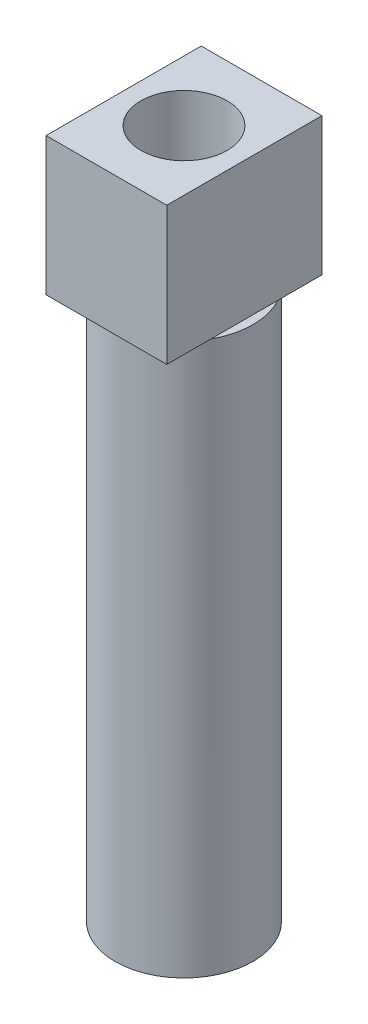
ISO-10303-21;
HEADER;
FILE_DESCRIPTION(('STEP AP214'),'2;1');
FILE_NAME('part.step','',(''),(''),'','','');
FILE_SCHEMA(('AUTOMOTIVE_DESIGN { 1 0 10303 214 1 1 1 1 }'));
ENDSEC;
DATA;
#1=APPLICATION_CONTEXT('core data for automotive mechanical design processes');
#2=APPLICATION_PROTOCOL_DEFINITION('international standard','automotive_design',2000,#1);
#3=PRODUCT_CONTEXT('',#1,'mechanical');
#4=PRODUCT('Part','Part','',(#3));
#5=PRODUCT_RELATED_PRODUCT_CATEGORY('part','',(#4));
#6=PRODUCT_DEFINITION_FORMATION('','',#4);
#7=PRODUCT_DEFINITION_CONTEXT('part definition',#1,'design');
#8=PRODUCT_DEFINITION('design','',#6,#7);
#9=PRODUCT_DEFINITION_SHAPE('','',#8);
#10=(LENGTH_UNIT() NAMED_UNIT(*) SI_UNIT(.MILLI.,.METRE.));
#11=(NAMED_UNIT(*) PLANE_ANGLE_UNIT() SI_UNIT($,.RADIAN.));
#12=(NAMED_UNIT(*) SI_UNIT($,.STERADIAN.) SOLID_ANGLE_UNIT());
#13=UNCERTAINTY_MEASURE_WITH_UNIT(LENGTH_MEASURE(1.E-05),#10,'distance_accuracy_value','');
#14=(GEOMETRIC_REPRESENTATION_CONTEXT(3) GLOBAL_UNCERTAINTY_ASSIGNED_CONTEXT((#13)) GLOBAL_UNIT_ASSIGNED_CONTEXT((#10,
#11,#12)) REPRESENTATION_CONTEXT('',''));
#15=CARTESIAN_POINT('',(0.,0.,0.));
#16=DIRECTION('',(0.,0.,1.));
#17=DIRECTION('',(1.,0.,0.));
#18=AXIS2_PLACEMENT_3D('',#15,#16,#17);
#19=CARTESIAN_POINT('',(0.,0.,0.));
#20=DIRECTION('',(0.,1.,0.));
#21=DIRECTION('',(0.,0.,1.));
#22=AXIS2_PLACEMENT_3D('',#19,#20,#21);
#23=PLANE('',#22);
#24=CARTESIAN_POINT('',(0.,0.,0.));
#25=DIRECTION('',(0.,1.,0.));
#26=DIRECTION('',(0.,0.,1.));
#27=AXIS2_PLACEMENT_3D('',#24,#25,#26);
#28=CIRCLE('',#27,12.5);
#29=CARTESIAN_POINT('',(0.,0.,12.5));
#30=VERTEX_POINT('',#29);
#31=EDGE_CURVE('E173',#30,#30,#28,.T.);
#32=ORIENTED_EDGE('',*,*,#31,.T.);
#33=EDGE_LOOP('',(#32));
#34=FACE_BOUND('',#33,.T.);
#35=CARTESIAN_POINT('',(0.,0.,0.));
#36=DIRECTION('',(0.,1.,0.));
#37=DIRECTION('',(0.,0.,1.));
#38=AXIS2_PLACEMENT_3D('',#35,#36,#37);
#39=CIRCLE('',#38,13.5);
#40=CARTESIAN_POINT('',(0.,0.,13.5));
#41=VERTEX_POINT('',#40);
#42=EDGE_CURVE('E182',#41,#41,#39,.T.);
#43=ORIENTED_EDGE('',*,*,#42,.F.);
#44=EDGE_LOOP('',(#43));
#45=FACE_BOUND('',#44,.T.);
#46=ADVANCED_FACE('F35',(#34,#45),#23,.F.);
#47=CARTESIAN_POINT('',(0.,160.,0.));
#48=DIRECTION('',(0.,1.,0.));
#49=DIRECTION('',(0.,0.,1.));
#50=AXIS2_PLACEMENT_3D('',#47,#48,#49);
#51=PLANE('',#50);
#52=DIRECTION('',(0.,0.,-1.));
#53=VECTOR('',#52,1.);
#54=CARTESIAN_POINT('',(17.5,160.,-22.5));
#55=LINE('',#54,#53);
#56=CARTESIAN_POINT('',(17.5,160.,9.68245836551855));
#57=VERTEX_POINT('',#56);
#58=CARTESIAN_POINT('',(17.5,160.,-9.68245836551856));
#59=VERTEX_POINT('',#58);
#60=EDGE_CURVE('E11',#57,#59,#55,.T.);
#61=ORIENTED_EDGE('',*,*,#60,.F.);
#62=CARTESIAN_POINT('',(0.,160.,0.));
#63=DIRECTION('',(0.,1.,0.));
#64=DIRECTION('',(0.,0.,1.));
#65=AXIS2_PLACEMENT_3D('',#62,#63,#64);
#66=CIRCLE('',#65,20.);
#67=EDGE_CURVE('E218',#57,#59,#66,.T.);
#68=ORIENTED_EDGE('',*,*,#67,.T.);
#69=EDGE_LOOP('',(#61,#68));
#70=FACE_BOUND('',#69,.T.);
#71=ADVANCED_FACE('F245',(#70),#51,.T.);
#72=CARTESIAN_POINT('',(0.,160.,0.));
#73=DIRECTION('',(0.,-1.,0.));
#74=DIRECTION('',(0.,0.,-1.));
#75=AXIS2_PLACEMENT_3D('',#72,#73,#74);
#76=CYLINDRICAL_SURFACE('',#75,20.);
#77=ORIENTED_EDGE('',*,*,#67,.F.);
#78=CARTESIAN_POINT('',(-17.5,160.,9.68245836551854));
#79=VERTEX_POINT('',#78);
#80=EDGE_CURVE('E219',#79,#57,#66,.T.);
#81=ORIENTED_EDGE('',*,*,#80,.F.);
#82=CARTESIAN_POINT('',(-17.5,160.,-9.68245836551855));
#83=VERTEX_POINT('',#82);
#84=EDGE_CURVE('E222',#83,#79,#66,.T.);
#85=ORIENTED_EDGE('',*,*,#84,.F.);
#86=EDGE_CURVE('E59',#59,#83,#66,.T.);
#87=ORIENTED_EDGE('',*,*,#86,.F.);
#88=EDGE_LOOP('',(#77,#81,#85,#87));
#89=FACE_BOUND('',#88,.T.);
#90=CARTESIAN_POINT('',(0.,0.,0.));
#91=DIRECTION('',(0.,1.,0.));
#92=DIRECTION('',(0.,0.,1.));
#93=AXIS2_PLACEMENT_3D('',#90,#91,#92);
#94=CIRCLE('',#93,20.);
#95=CARTESIAN_POINT('',(0.,0.,20.));
#96=VERTEX_POINT('',#95);
#97=EDGE_CURVE('E39',#96,#96,#94,.T.);
#98=ORIENTED_EDGE('',*,*,#97,.T.);
#99=EDGE_LOOP('',(#98));
#100=FACE_BOUND('',#99,.T.);
#101=ADVANCED_FACE('F37',(#89,#100),#76,.T.);
#102=DIRECTION('',(0.,0.,1.));
#103=VECTOR('',#102,1.);
#104=CARTESIAN_POINT('',(-17.5,160.,-22.5));
#105=LINE('',#104,#103);
#106=EDGE_CURVE('E44',#83,#79,#105,.T.);
#107=ORIENTED_EDGE('',*,*,#106,.F.);
#108=ORIENTED_EDGE('',*,*,#84,.T.);
#109=EDGE_LOOP('',(#107,#108));
#110=FACE_BOUND('',#109,.T.);
#111=ADVANCED_FACE('F235',(#110),#51,.T.);
#112=CARTESIAN_POINT('',(0.,0.,0.));
#113=DIRECTION('',(0.,1.,0.));
#114=DIRECTION('',(0.,0.,1.));
#115=AXIS2_PLACEMENT_3D('',#112,#113,#114);
#116=CIRCLE('',#115,19.);
#117=CARTESIAN_POINT('',(0.,0.,19.));
#118=VERTEX_POINT('',#117);
#119=EDGE_CURVE('E150',#118,#118,#116,.T.);
#120=ORIENTED_EDGE('',*,*,#119,.T.);
#121=EDGE_LOOP('',(#120));
#122=FACE_BOUND('',#121,.T.);
#123=ORIENTED_EDGE('',*,*,#97,.F.);
#124=EDGE_LOOP('',(#123));
#125=FACE_BOUND('',#124,.T.);
#126=ADVANCED_FACE('F232',(#122,#125),#23,.F.);
#127=CARTESIAN_POINT('',(0.,160.,0.));
#128=DIRECTION('',(0.,1.,0.));
#129=DIRECTION('',(0.,0.,1.));
#130=AXIS2_PLACEMENT_3D('',#127,#128,#129);
#131=PLANE('',#130);
#132=CARTESIAN_POINT('',(17.5,160.,-22.5));
#133=VERTEX_POINT('',#132);
#134=EDGE_CURVE('E47',#59,#133,#55,.T.);
#135=ORIENTED_EDGE('',*,*,#134,.F.);
#136=ORIENTED_EDGE('',*,*,#86,.T.);
#137=CARTESIAN_POINT('',(-17.5,160.,-22.5));
#138=VERTEX_POINT('',#137);
#139=EDGE_CURVE('E204',#138,#83,#105,.T.);
#140=ORIENTED_EDGE('',*,*,#139,.F.);
#141=DIRECTION('',(-1.,0.,0.));
#142=VECTOR('',#141,1.);
#143=CARTESIAN_POINT('',(-17.5,160.,-22.5));
#144=LINE('',#143,#142);
#145=EDGE_CURVE('E201',#133,#138,#144,.T.);
#146=ORIENTED_EDGE('',*,*,#145,.F.);
#147=EDGE_LOOP('',(#135,#136,#140,#146));
#148=FACE_BOUND('',#147,.T.);
#149=ADVANCED_FACE('F234',(#148),#131,.F.);
#150=CARTESIAN_POINT('',(-17.5,160.,22.5));
#151=VERTEX_POINT('',#150);
#152=EDGE_CURVE('E203',#79,#151,#105,.T.);
#153=ORIENTED_EDGE('',*,*,#152,.F.);
#154=ORIENTED_EDGE('',*,*,#80,.T.);
#155=CARTESIAN_POINT('',(17.5,160.,22.5));
#156=VERTEX_POINT('',#155);
#157=EDGE_CURVE('E46',#156,#57,#55,.T.);
#158=ORIENTED_EDGE('',*,*,#157,.F.);
#159=DIRECTION('',(1.,0.,0.));
#160=VECTOR('',#159,1.);
#161=CARTESIAN_POINT('',(-17.5,160.,22.5));
#162=LINE('',#161,#160);
#163=EDGE_CURVE('E193',#151,#156,#162,.T.);
#164=ORIENTED_EDGE('',*,*,#163,.F.);
#165=EDGE_LOOP('',(#153,#154,#158,#164));
#166=FACE_BOUND('',#165,.T.);
#167=ADVANCED_FACE('F241',(#166),#131,.F.);
#168=CARTESIAN_POINT('',(17.5,200.,-22.5));
#169=DIRECTION('',(-1.,0.,0.));
#170=DIRECTION('',(0.,0.,1.));
#171=AXIS2_PLACEMENT_3D('',#168,#169,#170);
#172=PLANE('',#171);
#173=ORIENTED_EDGE('',*,*,#157,.T.);
#174=ORIENTED_EDGE('',*,*,#60,.T.);
#175=ORIENTED_EDGE('',*,*,#134,.T.);
#176=DIRECTION('',(0.,-1.,0.));
#177=VECTOR('',#176,1.);
#178=CARTESIAN_POINT('',(17.5,200.,-22.5));
#179=LINE('',#178,#177);
#180=CARTESIAN_POINT('',(17.5,200.,-22.5));
#181=VERTEX_POINT('',#180);
#182=EDGE_CURVE('E216',#181,#133,#179,.T.);
#183=ORIENTED_EDGE('',*,*,#182,.F.);
#184=DIRECTION('',(0.,0.,-1.));
#185=VECTOR('',#184,1.);
#186=CARTESIAN_POINT('',(17.5,200.,-22.5));
#187=LINE('',#186,#185);
#188=CARTESIAN_POINT('',(17.5,200.,22.5));
#189=VERTEX_POINT('',#188);
#190=EDGE_CURVE('E189',#189,#181,#187,.T.);
#191=ORIENTED_EDGE('',*,*,#190,.F.);
#192=DIRECTION('',(0.,-1.,0.));
#193=VECTOR('',#192,1.);
#194=CARTESIAN_POINT('',(17.5,200.,22.5));
#195=LINE('',#194,#193);
#196=EDGE_CURVE('E198',#189,#156,#195,.T.);
#197=ORIENTED_EDGE('',*,*,#196,.T.);
#198=EDGE_LOOP('',(#173,#174,#175,#183,#191,#197));
#199=FACE_BOUND('',#198,.T.);
#200=ADVANCED_FACE('F370',(#199),#172,.F.);
#201=CARTESIAN_POINT('',(-17.5,200.,-22.5));
#202=DIRECTION('',(0.,0.,1.));
#203=DIRECTION('',(1.,0.,0.));
#204=AXIS2_PLACEMENT_3D('',#201,#202,#203);
#205=PLANE('',#204);
#206=ORIENTED_EDGE('',*,*,#145,.T.);
#207=DIRECTION('',(0.,-1.,0.));
#208=VECTOR('',#207,1.);
#209=CARTESIAN_POINT('',(-17.5,200.,-22.5));
#210=LINE('',#209,#208);
#211=CARTESIAN_POINT('',(-17.5,200.,-22.5));
#212=VERTEX_POINT('',#211);
#213=EDGE_CURVE('E213',#212,#138,#210,.T.);
#214=ORIENTED_EDGE('',*,*,#213,.F.);
#215=DIRECTION('',(-1.,0.,0.));
#216=VECTOR('',#215,1.);
#217=CARTESIAN_POINT('',(-17.5,200.,-22.5));
#218=LINE('',#217,#216);
#219=EDGE_CURVE('E192',#181,#212,#218,.T.);
#220=ORIENTED_EDGE('',*,*,#219,.F.);
#221=ORIENTED_EDGE('',*,*,#182,.T.);
#222=EDGE_LOOP('',(#206,#214,#220,#221));
#223=FACE_BOUND('',#222,.T.);
#224=ADVANCED_FACE('F366',(#223),#205,.F.);
#225=CARTESIAN_POINT('',(-17.5,200.,-22.5));
#226=DIRECTION('',(1.,0.,0.));
#227=DIRECTION('',(0.,0.,-1.));
#228=AXIS2_PLACEMENT_3D('',#225,#226,#227);
#229=PLANE('',#228);
#230=ORIENTED_EDGE('',*,*,#139,.T.);
#231=ORIENTED_EDGE('',*,*,#106,.T.);
#232=ORIENTED_EDGE('',*,*,#152,.T.);
#233=DIRECTION('',(0.,-1.,0.));
#234=VECTOR('',#233,1.);
#235=CARTESIAN_POINT('',(-17.5,200.,22.5));
#236=LINE('',#235,#234);
#237=CARTESIAN_POINT('',(-17.5,200.,22.5));
#238=VERTEX_POINT('',#237);
#239=EDGE_CURVE('E210',#238,#151,#236,.T.);
#240=ORIENTED_EDGE('',*,*,#239,.F.);
#241=DIRECTION('',(0.,0.,1.));
#242=VECTOR('',#241,1.);
#243=CARTESIAN_POINT('',(-17.5,200.,-22.5));
#244=LINE('',#243,#242);
#245=EDGE_CURVE('E195',#212,#238,#244,.T.);
#246=ORIENTED_EDGE('',*,*,#245,.F.);
#247=ORIENTED_EDGE('',*,*,#213,.T.);
#248=EDGE_LOOP('',(#230,#231,#232,#240,#246,#247));
#249=FACE_BOUND('',#248,.T.);
#250=ADVANCED_FACE('F362',(#249),#229,.F.);
#251=CARTESIAN_POINT('',(-17.5,200.,22.5));
#252=DIRECTION('',(0.,0.,-1.));
#253=DIRECTION('',(-1.,0.,0.));
#254=AXIS2_PLACEMENT_3D('',#251,#252,#253);
#255=PLANE('',#254);
#256=ORIENTED_EDGE('',*,*,#163,.T.);
#257=ORIENTED_EDGE('',*,*,#196,.F.);
#258=DIRECTION('',(1.,0.,0.));
#259=VECTOR('',#258,1.);
#260=CARTESIAN_POINT('',(-17.5,200.,22.5));
#261=LINE('',#260,#259);
#262=EDGE_CURVE('E197',#238,#189,#261,.T.);
#263=ORIENTED_EDGE('',*,*,#262,.F.);
#264=ORIENTED_EDGE('',*,*,#239,.T.);
#265=EDGE_LOOP('',(#256,#257,#263,#264));
#266=FACE_BOUND('',#265,.T.);
#267=ADVANCED_FACE('F357',(#266),#255,.F.);
#268=CARTESIAN_POINT('',(0.,200.,0.));
#269=DIRECTION('',(0.,1.,0.));
#270=DIRECTION('',(0.,0.,1.));
#271=AXIS2_PLACEMENT_3D('',#268,#269,#270);
#272=PLANE('',#271);
#273=CARTESIAN_POINT('',(0.,200.,0.));
#274=DIRECTION('',(0.,1.,0.));
#275=DIRECTION('',(0.,0.,1.));
#276=AXIS2_PLACEMENT_3D('',#273,#274,#275);
#277=CIRCLE('',#276,12.5);
#278=CARTESIAN_POINT('',(0.,200.,12.5));
#279=VERTEX_POINT('',#278);
#280=EDGE_CURVE('E169',#279,#279,#277,.T.);
#281=ORIENTED_EDGE('',*,*,#280,.F.);
#282=EDGE_LOOP('',(#281));
#283=FACE_BOUND('',#282,.T.);
#284=ORIENTED_EDGE('',*,*,#190,.T.);
#285=ORIENTED_EDGE('',*,*,#219,.T.);
#286=ORIENTED_EDGE('',*,*,#245,.T.);
#287=ORIENTED_EDGE('',*,*,#262,.T.);
#288=EDGE_LOOP('',(#284,#285,#286,#287));
#289=FACE_BOUND('',#288,.T.);
#290=ADVANCED_FACE('F332',(#283,#289),#272,.T.);
#291=CARTESIAN_POINT('',(0.,0.,0.));
#292=DIRECTION('',(0.,1.,0.));
#293=DIRECTION('',(0.,0.,1.));
#294=AXIS2_PLACEMENT_3D('',#291,#292,#293);
#295=CYLINDRICAL_SURFACE('',#294,12.5);
#296=ORIENTED_EDGE('',*,*,#31,.F.);
#297=EDGE_LOOP('',(#296));
#298=FACE_BOUND('',#297,.T.);
#299=ORIENTED_EDGE('',*,*,#280,.T.);
#300=EDGE_LOOP('',(#299));
#301=FACE_BOUND('',#300,.T.);
#302=ADVANCED_FACE('F324',(#298,#301),#295,.F.);
#303=CARTESIAN_POINT('',(0.,159.,0.));
#304=DIRECTION('',(0.,1.,0.));
#305=DIRECTION('',(0.,0.,1.));
#306=AXIS2_PLACEMENT_3D('',#303,#304,#305);
#307=PLANE('',#306);
#308=DIRECTION('',(0.,0.,-1.));
#309=VECTOR('',#308,1.);
#310=CARTESIAN_POINT('',(16.5,159.,-22.5));
#311=LINE('',#310,#309);
#312=CARTESIAN_POINT('',(16.5,159.,9.42072184070839));
#313=VERTEX_POINT('',#312);
#314=CARTESIAN_POINT('',(16.5,159.,-9.42072184070839));
#315=VERTEX_POINT('',#314);
#316=EDGE_CURVE('E274',#313,#315,#311,.T.);
#317=ORIENTED_EDGE('',*,*,#316,.T.);
#318=CARTESIAN_POINT('',(0.,159.,0.));
#319=DIRECTION('',(0.,1.,0.));
#320=DIRECTION('',(0.,0.,1.));
#321=AXIS2_PLACEMENT_3D('',#318,#319,#320);
#322=CIRCLE('',#321,19.);
#323=EDGE_CURVE('E282',#313,#315,#322,.T.);
#324=ORIENTED_EDGE('',*,*,#323,.F.);
#325=EDGE_LOOP('',(#317,#324));
#326=FACE_BOUND('',#325,.T.);
#327=ADVANCED_FACE('F321',(#326),#307,.F.);
#328=CARTESIAN_POINT('',(0.,160.,0.));
#329=DIRECTION('',(0.,-1.,0.));
#330=DIRECTION('',(0.,0.,-1.));
#331=AXIS2_PLACEMENT_3D('',#328,#329,#330);
#332=CYLINDRICAL_SURFACE('',#331,19.);
#333=ORIENTED_EDGE('',*,*,#323,.T.);
#334=DIRECTION('',(0.,-1.,0.));
#335=VECTOR('',#334,1.);
#336=CARTESIAN_POINT('',(16.5,159.,-9.42072184070839));
#337=LINE('',#336,#335);
#338=CARTESIAN_POINT('',(16.5,161.,-9.42072184070839));
#339=VERTEX_POINT('',#338);
#340=EDGE_CURVE('E272',#315,#339,#337,.F.);
#341=ORIENTED_EDGE('',*,*,#340,.T.);
#342=CARTESIAN_POINT('',(0.,161.,0.));
#343=DIRECTION('',(0.,1.,0.));
#344=DIRECTION('',(0.,0.,1.));
#345=AXIS2_PLACEMENT_3D('',#342,#343,#344);
#346=CIRCLE('',#345,19.);
#347=CARTESIAN_POINT('',(-16.5,161.,-9.42072184070839));
#348=VERTEX_POINT('',#347);
#349=EDGE_CURVE('E279',#339,#348,#346,.T.);
#350=ORIENTED_EDGE('',*,*,#349,.T.);
#351=DIRECTION('',(0.,-1.,0.));
#352=VECTOR('',#351,1.);
#353=CARTESIAN_POINT('',(-16.5,159.,-9.42072184070839));
#354=LINE('',#353,#352);
#355=CARTESIAN_POINT('',(-16.5,159.,-9.42072184070839));
#356=VERTEX_POINT('',#355);
#357=EDGE_CURVE('E175',#356,#348,#354,.F.);
#358=ORIENTED_EDGE('',*,*,#357,.F.);
#359=CARTESIAN_POINT('',(0.,159.,0.));
#360=DIRECTION('',(0.,1.,0.));
#361=DIRECTION('',(0.,0.,1.));
#362=AXIS2_PLACEMENT_3D('',#359,#360,#361);
#363=CIRCLE('',#362,19.);
#364=CARTESIAN_POINT('',(-16.5,159.,9.42072184070839));
#365=VERTEX_POINT('',#364);
#366=EDGE_CURVE('E149',#356,#365,#363,.T.);
#367=ORIENTED_EDGE('',*,*,#366,.T.);
#368=DIRECTION('',(0.,-1.,0.));
#369=VECTOR('',#368,1.);
#370=CARTESIAN_POINT('',(-16.5,159.,9.42072184070839));
#371=LINE('',#370,#369);
#372=CARTESIAN_POINT('',(-16.5,161.,9.42072184070839));
#373=VERTEX_POINT('',#372);
#374=EDGE_CURVE('E156',#365,#373,#371,.F.);
#375=ORIENTED_EDGE('',*,*,#374,.T.);
#376=CARTESIAN_POINT('',(0.,161.,0.));
#377=DIRECTION('',(0.,1.,0.));
#378=DIRECTION('',(0.,0.,1.));
#379=AXIS2_PLACEMENT_3D('',#376,#377,#378);
#380=CIRCLE('',#379,19.);
#381=CARTESIAN_POINT('',(16.5,161.,9.42072184070839));
#382=VERTEX_POINT('',#381);
#383=EDGE_CURVE('E139',#373,#382,#380,.T.);
#384=ORIENTED_EDGE('',*,*,#383,.T.);
#385=DIRECTION('',(0.,-1.,0.));
#386=VECTOR('',#385,1.);
#387=CARTESIAN_POINT('',(16.5,159.,9.42072184070839));
#388=LINE('',#387,#386);
#389=EDGE_CURVE('E170',#313,#382,#388,.F.);
#390=ORIENTED_EDGE('',*,*,#389,.F.);
#391=EDGE_LOOP('',(#333,#341,#350,#358,#367,#375,#384,#390));
#392=FACE_BOUND('',#391,.T.);
#393=ORIENTED_EDGE('',*,*,#119,.F.);
#394=EDGE_LOOP('',(#393));
#395=FACE_BOUND('',#394,.T.);
#396=ADVANCED_FACE('F165',(#392,#395),#332,.F.);
#397=DIRECTION('',(0.,0.,1.));
#398=VECTOR('',#397,1.);
#399=CARTESIAN_POINT('',(-16.5,159.,-22.5));
#400=LINE('',#399,#398);
#401=EDGE_CURVE('E277',#356,#365,#400,.T.);
#402=ORIENTED_EDGE('',*,*,#401,.T.);
#403=ORIENTED_EDGE('',*,*,#366,.F.);
#404=EDGE_LOOP('',(#402,#403));
#405=FACE_BOUND('',#404,.T.);
#406=ADVANCED_FACE('F326',(#405),#307,.F.);
#407=CARTESIAN_POINT('',(0.,161.,0.));
#408=DIRECTION('',(0.,1.,0.));
#409=DIRECTION('',(0.,0.,1.));
#410=AXIS2_PLACEMENT_3D('',#407,#408,#409);
#411=PLANE('',#410);
#412=DIRECTION('',(0.,0.,-1.));
#413=VECTOR('',#412,1.);
#414=CARTESIAN_POINT('',(16.5,161.,-22.5));
#415=LINE('',#414,#413);
#416=CARTESIAN_POINT('',(16.5,161.,-21.5));
#417=VERTEX_POINT('',#416);
#418=EDGE_CURVE('E185',#339,#417,#415,.T.);
#419=ORIENTED_EDGE('',*,*,#418,.T.);
#420=DIRECTION('',(-1.,0.,0.));
#421=VECTOR('',#420,1.);
#422=CARTESIAN_POINT('',(-17.5,161.,-21.5));
#423=LINE('',#422,#421);
#424=CARTESIAN_POINT('',(-16.5,161.,-21.5));
#425=VERTEX_POINT('',#424);
#426=EDGE_CURVE('E162',#417,#425,#423,.T.);
#427=ORIENTED_EDGE('',*,*,#426,.T.);
#428=DIRECTION('',(0.,0.,1.));
#429=VECTOR('',#428,1.);
#430=CARTESIAN_POINT('',(-16.5,161.,-22.5));
#431=LINE('',#430,#429);
#432=EDGE_CURVE('E161',#425,#348,#431,.T.);
#433=ORIENTED_EDGE('',*,*,#432,.T.);
#434=ORIENTED_EDGE('',*,*,#349,.F.);
#435=EDGE_LOOP('',(#419,#427,#433,#434));
#436=FACE_BOUND('',#435,.T.);
#437=ADVANCED_FACE('F336',(#436),#411,.T.);
#438=DIRECTION('',(0.,0.,1.));
#439=VECTOR('',#438,1.);
#440=CARTESIAN_POINT('',(-16.5,161.,-22.5));
#441=LINE('',#440,#439);
#442=CARTESIAN_POINT('',(-16.5,161.,21.5));
#443=VERTEX_POINT('',#442);
#444=EDGE_CURVE('E142',#373,#443,#441,.T.);
#445=ORIENTED_EDGE('',*,*,#444,.T.);
#446=DIRECTION('',(1.,0.,0.));
#447=VECTOR('',#446,1.);
#448=CARTESIAN_POINT('',(-17.5,161.,21.5));
#449=LINE('',#448,#447);
#450=CARTESIAN_POINT('',(16.5,161.,21.5));
#451=VERTEX_POINT('',#450);
#452=EDGE_CURVE('E290',#443,#451,#449,.T.);
#453=ORIENTED_EDGE('',*,*,#452,.T.);
#454=DIRECTION('',(0.,0.,-1.));
#455=VECTOR('',#454,1.);
#456=CARTESIAN_POINT('',(16.5,161.,-22.5));
#457=LINE('',#456,#455);
#458=EDGE_CURVE('E145',#451,#382,#457,.T.);
#459=ORIENTED_EDGE('',*,*,#458,.T.);
#460=ORIENTED_EDGE('',*,*,#383,.F.);
#461=EDGE_LOOP('',(#445,#453,#459,#460));
#462=FACE_BOUND('',#461,.T.);
#463=ADVANCED_FACE('F141',(#462),#411,.T.);
#464=CARTESIAN_POINT('',(16.5,200.,-22.5));
#465=DIRECTION('',(-1.,0.,0.));
#466=DIRECTION('',(0.,0.,1.));
#467=AXIS2_PLACEMENT_3D('',#464,#465,#466);
#468=PLANE('',#467);
#469=ORIENTED_EDGE('',*,*,#458,.F.);
#470=DIRECTION('',(0.,-1.,0.));
#471=VECTOR('',#470,1.);
#472=CARTESIAN_POINT('',(16.5,200.,21.5));
#473=LINE('',#472,#471);
#474=CARTESIAN_POINT('',(16.5,199.,21.5));
#475=VERTEX_POINT('',#474);
#476=EDGE_CURVE('E270',#475,#451,#473,.T.);
#477=ORIENTED_EDGE('',*,*,#476,.F.);
#478=DIRECTION('',(0.,0.,-1.));
#479=VECTOR('',#478,1.);
#480=CARTESIAN_POINT('',(16.5,199.,-22.5));
#481=LINE('',#480,#479);
#482=CARTESIAN_POINT('',(16.5,199.,-21.5));
#483=VERTEX_POINT('',#482);
#484=EDGE_CURVE('E296',#475,#483,#481,.T.);
#485=ORIENTED_EDGE('',*,*,#484,.T.);
#486=DIRECTION('',(0.,-1.,0.));
#487=VECTOR('',#486,1.);
#488=CARTESIAN_POINT('',(16.5,200.,-21.5));
#489=LINE('',#488,#487);
#490=EDGE_CURVE('E181',#483,#417,#489,.T.);
#491=ORIENTED_EDGE('',*,*,#490,.T.);
#492=ORIENTED_EDGE('',*,*,#418,.F.);
#493=ORIENTED_EDGE('',*,*,#340,.F.);
#494=ORIENTED_EDGE('',*,*,#316,.F.);
#495=ORIENTED_EDGE('',*,*,#389,.T.);
#496=EDGE_LOOP('',(#469,#477,#485,#491,#492,#493,#494,#495));
#497=FACE_BOUND('',#496,.T.);
#498=ADVANCED_FACE('F316',(#497),#468,.T.);
#499=CARTESIAN_POINT('',(-17.5,200.,-21.5));
#500=DIRECTION('',(0.,0.,1.));
#501=DIRECTION('',(1.,0.,0.));
#502=AXIS2_PLACEMENT_3D('',#499,#500,#501);
#503=PLANE('',#502);
#504=ORIENTED_EDGE('',*,*,#426,.F.);
#505=ORIENTED_EDGE('',*,*,#490,.F.);
#506=DIRECTION('',(-1.,0.,0.));
#507=VECTOR('',#506,1.);
#508=CARTESIAN_POINT('',(-17.5,199.,-21.5));
#509=LINE('',#508,#507);
#510=CARTESIAN_POINT('',(-16.5,199.,-21.5));
#511=VERTEX_POINT('',#510);
#512=EDGE_CURVE('E266',#483,#511,#509,.T.);
#513=ORIENTED_EDGE('',*,*,#512,.T.);
#514=DIRECTION('',(0.,-1.,0.));
#515=VECTOR('',#514,1.);
#516=CARTESIAN_POINT('',(-16.5,200.,-21.5));
#517=LINE('',#516,#515);
#518=EDGE_CURVE('E295',#511,#425,#517,.T.);
#519=ORIENTED_EDGE('',*,*,#518,.T.);
#520=EDGE_LOOP('',(#504,#505,#513,#519));
#521=FACE_BOUND('',#520,.T.);
#522=ADVANCED_FACE('F306',(#521),#503,.T.);
#523=CARTESIAN_POINT('',(-16.5,200.,-22.5));
#524=DIRECTION('',(1.,0.,0.));
#525=DIRECTION('',(0.,0.,-1.));
#526=AXIS2_PLACEMENT_3D('',#523,#524,#525);
#527=PLANE('',#526);
#528=ORIENTED_EDGE('',*,*,#432,.F.);
#529=ORIENTED_EDGE('',*,*,#518,.F.);
#530=DIRECTION('',(0.,0.,1.));
#531=VECTOR('',#530,1.);
#532=CARTESIAN_POINT('',(-16.5,199.,-22.5));
#533=LINE('',#532,#531);
#534=CARTESIAN_POINT('',(-16.5,199.,21.5));
#535=VERTEX_POINT('',#534);
#536=EDGE_CURVE('E271',#511,#535,#533,.T.);
#537=ORIENTED_EDGE('',*,*,#536,.T.);
#538=DIRECTION('',(0.,-1.,0.));
#539=VECTOR('',#538,1.);
#540=CARTESIAN_POINT('',(-16.5,200.,21.5));
#541=LINE('',#540,#539);
#542=EDGE_CURVE('E159',#535,#443,#541,.T.);
#543=ORIENTED_EDGE('',*,*,#542,.T.);
#544=ORIENTED_EDGE('',*,*,#444,.F.);
#545=ORIENTED_EDGE('',*,*,#374,.F.);
#546=ORIENTED_EDGE('',*,*,#401,.F.);
#547=ORIENTED_EDGE('',*,*,#357,.T.);
#548=EDGE_LOOP('',(#528,#529,#537,#543,#544,#545,#546,#547));
#549=FACE_BOUND('',#548,.T.);
#550=ADVANCED_FACE('F154',(#549),#527,.T.);
#551=CARTESIAN_POINT('',(-17.5,200.,21.5));
#552=DIRECTION('',(0.,0.,-1.));
#553=DIRECTION('',(-1.,0.,0.));
#554=AXIS2_PLACEMENT_3D('',#551,#552,#553);
#555=PLANE('',#554);
#556=ORIENTED_EDGE('',*,*,#452,.F.);
#557=ORIENTED_EDGE('',*,*,#542,.F.);
#558=DIRECTION('',(1.,0.,0.));
#559=VECTOR('',#558,1.);
#560=CARTESIAN_POINT('',(-17.5,199.,21.5));
#561=LINE('',#560,#559);
#562=EDGE_CURVE('E268',#535,#475,#561,.T.);
#563=ORIENTED_EDGE('',*,*,#562,.T.);
#564=ORIENTED_EDGE('',*,*,#476,.T.);
#565=EDGE_LOOP('',(#556,#557,#563,#564));
#566=FACE_BOUND('',#565,.T.);
#567=ADVANCED_FACE('F314',(#566),#555,.T.);
#568=CARTESIAN_POINT('',(0.,199.,0.));
#569=DIRECTION('',(0.,1.,0.));
#570=DIRECTION('',(0.,0.,1.));
#571=AXIS2_PLACEMENT_3D('',#568,#569,#570);
#572=PLANE('',#571);
#573=CARTESIAN_POINT('',(0.,199.,0.));
#574=DIRECTION('',(0.,1.,0.));
#575=DIRECTION('',(0.,0.,1.));
#576=AXIS2_PLACEMENT_3D('',#573,#574,#575);
#577=CIRCLE('',#576,13.5);
#578=CARTESIAN_POINT('',(0.,199.,13.5));
#579=VERTEX_POINT('',#578);
#580=EDGE_CURVE('E186',#579,#579,#577,.T.);
#581=ORIENTED_EDGE('',*,*,#580,.T.);
#582=EDGE_LOOP('',(#581));
#583=FACE_BOUND('',#582,.T.);
#584=ORIENTED_EDGE('',*,*,#484,.F.);
#585=ORIENTED_EDGE('',*,*,#562,.F.);
#586=ORIENTED_EDGE('',*,*,#536,.F.);
#587=ORIENTED_EDGE('',*,*,#512,.F.);
#588=EDGE_LOOP('',(#584,#585,#586,#587));
#589=FACE_BOUND('',#588,.T.);
#590=ADVANCED_FACE('F258',(#583,#589),#572,.F.);
#591=CARTESIAN_POINT('',(0.,0.,0.));
#592=DIRECTION('',(0.,1.,0.));
#593=DIRECTION('',(0.,0.,1.));
#594=AXIS2_PLACEMENT_3D('',#591,#592,#593);
#595=CYLINDRICAL_SURFACE('',#594,13.5);
#596=ORIENTED_EDGE('',*,*,#42,.T.);
#597=EDGE_LOOP('',(#596));
#598=FACE_BOUND('',#597,.T.);
#599=ORIENTED_EDGE('',*,*,#580,.F.);
#600=EDGE_LOOP('',(#599));
#601=FACE_BOUND('',#600,.T.);
#602=ADVANCED_FACE('F255',(#598,#601),#595,.T.);
#603=CLOSED_SHELL('',(#46,#71,#101,#111,#126,#149,#167,#200,#224,#250,#267,#290,#302,#327,#396,
#406,#437,#463,#498,#522,#550,#567,#590,#602));
#604=MANIFOLD_SOLID_BREP('B2',#603);
#605=ADVANCED_BREP_SHAPE_REPRESENTATION('',(#18,#604),#14);
#606=SHAPE_DEFINITION_REPRESENTATION(#9,#605);
ENDSEC;
END-ISO-10303-21;
